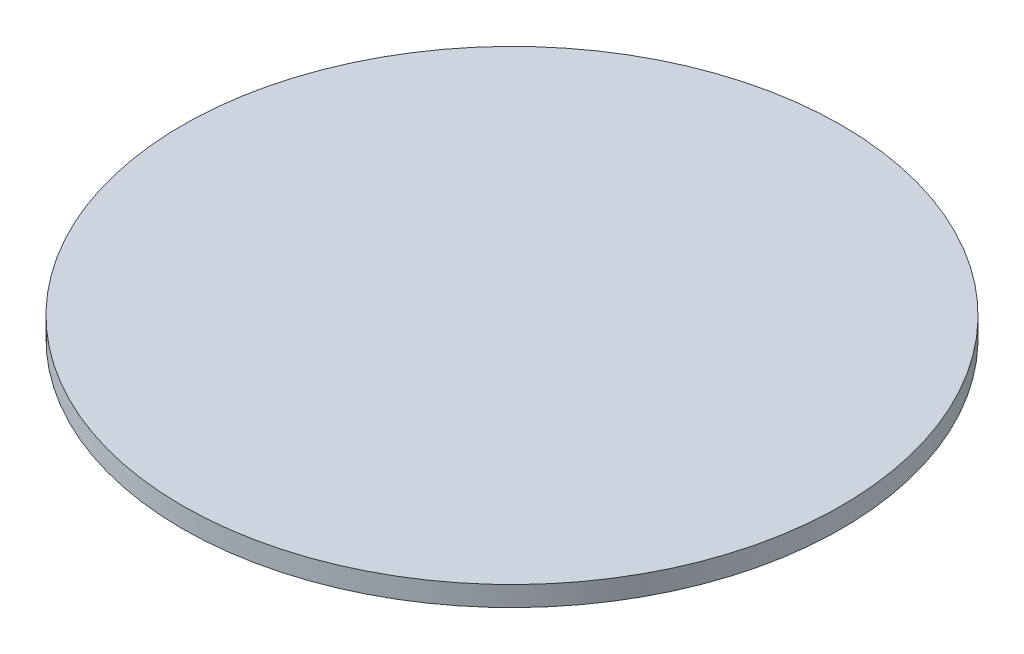
ISO-10303-21;
HEADER;
FILE_DESCRIPTION(('STEP AP214'),'2;1');
FILE_NAME('part.step','',(''),(''),'','','');
FILE_SCHEMA(('AUTOMOTIVE_DESIGN { 1 0 10303 214 1 1 1 1 }'));
ENDSEC;
DATA;
#1=APPLICATION_CONTEXT('core data for automotive mechanical design processes');
#2=APPLICATION_PROTOCOL_DEFINITION('international standard','automotive_design',2000,#1);
#3=PRODUCT_CONTEXT('',#1,'mechanical');
#4=PRODUCT('Part','Part','',(#3));
#5=PRODUCT_RELATED_PRODUCT_CATEGORY('part','',(#4));
#6=PRODUCT_DEFINITION_FORMATION('','',#4);
#7=PRODUCT_DEFINITION_CONTEXT('part definition',#1,'design');
#8=PRODUCT_DEFINITION('design','',#6,#7);
#9=PRODUCT_DEFINITION_SHAPE('','',#8);
#10=(LENGTH_UNIT() NAMED_UNIT(*) SI_UNIT(.MILLI.,.METRE.));
#11=(NAMED_UNIT(*) PLANE_ANGLE_UNIT() SI_UNIT($,.RADIAN.));
#12=(NAMED_UNIT(*) SI_UNIT($,.STERADIAN.) SOLID_ANGLE_UNIT());
#13=UNCERTAINTY_MEASURE_WITH_UNIT(LENGTH_MEASURE(1.E-05),#10,'distance_accuracy_value','');
#14=(GEOMETRIC_REPRESENTATION_CONTEXT(3) GLOBAL_UNCERTAINTY_ASSIGNED_CONTEXT((#13)) GLOBAL_UNIT_ASSIGNED_CONTEXT((#10,
#11,#12)) REPRESENTATION_CONTEXT('',''));
#15=CARTESIAN_POINT('',(0.,0.,0.));
#16=DIRECTION('',(0.,0.,1.));
#17=DIRECTION('',(1.,0.,0.));
#18=AXIS2_PLACEMENT_3D('',#15,#16,#17);
#19=CARTESIAN_POINT('',(0.,1.,0.));
#20=DIRECTION('',(0.,-1.,0.));
#21=DIRECTION('',(0.,0.,-1.));
#22=AXIS2_PLACEMENT_3D('',#19,#20,#21);
#23=CYLINDRICAL_SURFACE('',#22,16.5);
#24=CARTESIAN_POINT('',(0.,1.,0.));
#25=DIRECTION('',(0.,1.,0.));
#26=DIRECTION('',(0.,0.,1.));
#27=AXIS2_PLACEMENT_3D('',#24,#25,#26);
#28=CIRCLE('',#27,16.5);
#29=CARTESIAN_POINT('',(0.,1.,16.5));
#30=VERTEX_POINT('',#29);
#31=EDGE_CURVE('E10',#30,#30,#28,.T.);
#32=ORIENTED_EDGE('',*,*,#31,.F.);
#33=EDGE_LOOP('',(#32));
#34=FACE_BOUND('',#33,.T.);
#35=CARTESIAN_POINT('',(0.,0.,0.));
#36=DIRECTION('',(0.,1.,0.));
#37=DIRECTION('',(0.,0.,1.));
#38=AXIS2_PLACEMENT_3D('',#35,#36,#37);
#39=CIRCLE('',#38,16.5);
#40=CARTESIAN_POINT('',(0.,0.,16.5));
#41=VERTEX_POINT('',#40);
#42=EDGE_CURVE('E33',#41,#41,#39,.T.);
#43=ORIENTED_EDGE('',*,*,#42,.T.);
#44=EDGE_LOOP('',(#43));
#45=FACE_BOUND('',#44,.T.);
#46=ADVANCED_FACE('F30',(#34,#45),#23,.T.);
#47=CARTESIAN_POINT('',(0.,1.,0.));
#48=DIRECTION('',(0.,1.,0.));
#49=DIRECTION('',(0.,0.,1.));
#50=AXIS2_PLACEMENT_3D('',#47,#48,#49);
#51=PLANE('',#50);
#52=ORIENTED_EDGE('',*,*,#31,.T.);
#53=EDGE_LOOP('',(#52));
#54=FACE_BOUND('',#53,.T.);
#55=ADVANCED_FACE('F45',(#54),#51,.T.);
#56=CARTESIAN_POINT('',(0.,0.,0.));
#57=DIRECTION('',(0.,1.,0.));
#58=DIRECTION('',(0.,0.,1.));
#59=AXIS2_PLACEMENT_3D('',#56,#57,#58);
#60=PLANE('',#59);
#61=ORIENTED_EDGE('',*,*,#42,.F.);
#62=EDGE_LOOP('',(#61));
#63=FACE_BOUND('',#62,.T.);
#64=ADVANCED_FACE('F43',(#63),#60,.F.);
#65=CLOSED_SHELL('',(#46,#55,#64));
#66=MANIFOLD_SOLID_BREP('B2',#65);
#67=ADVANCED_BREP_SHAPE_REPRESENTATION('',(#18,#66),#14);
#68=SHAPE_DEFINITION_REPRESENTATION(#9,#67);
ENDSEC;
END-ISO-10303-21;
